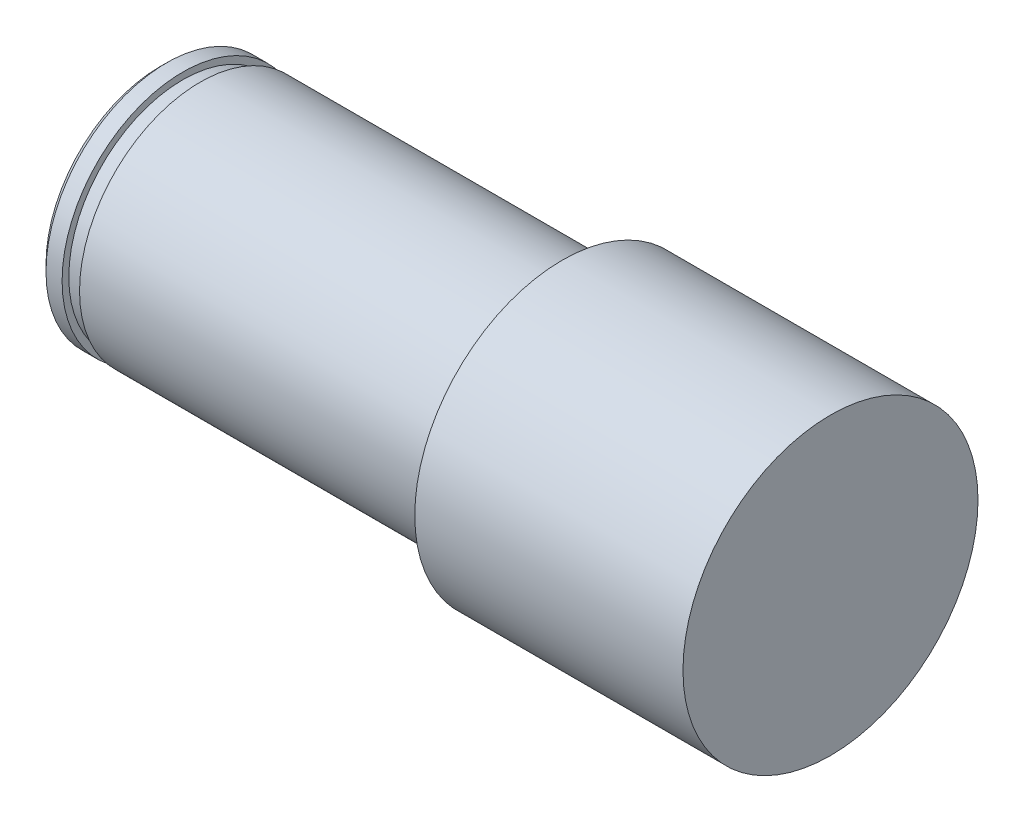
ISO-10303-21;
HEADER;
FILE_DESCRIPTION(('STEP AP214'),'2;1');
FILE_NAME('part.step','',(''),(''),'','','');
FILE_SCHEMA(('AUTOMOTIVE_DESIGN { 1 0 10303 214 1 1 1 1 }'));
ENDSEC;
DATA;
#1=APPLICATION_CONTEXT('core data for automotive mechanical design processes');
#2=APPLICATION_PROTOCOL_DEFINITION('international standard','automotive_design',2000,#1);
#3=PRODUCT_CONTEXT('',#1,'mechanical');
#4=PRODUCT('Part','Part','',(#3));
#5=PRODUCT_RELATED_PRODUCT_CATEGORY('part','',(#4));
#6=PRODUCT_DEFINITION_FORMATION('','',#4);
#7=PRODUCT_DEFINITION_CONTEXT('part definition',#1,'design');
#8=PRODUCT_DEFINITION('design','',#6,#7);
#9=PRODUCT_DEFINITION_SHAPE('','',#8);
#10=(LENGTH_UNIT() NAMED_UNIT(*) SI_UNIT(.MILLI.,.METRE.));
#11=(NAMED_UNIT(*) PLANE_ANGLE_UNIT() SI_UNIT($,.RADIAN.));
#12=(NAMED_UNIT(*) SI_UNIT($,.STERADIAN.) SOLID_ANGLE_UNIT());
#13=UNCERTAINTY_MEASURE_WITH_UNIT(LENGTH_MEASURE(1.E-05),#10,'distance_accuracy_value','');
#14=(GEOMETRIC_REPRESENTATION_CONTEXT(3) GLOBAL_UNCERTAINTY_ASSIGNED_CONTEXT((#13)) GLOBAL_UNIT_ASSIGNED_CONTEXT((#10,
#11,#12)) REPRESENTATION_CONTEXT('',''));
#15=CARTESIAN_POINT('',(0.,0.,0.));
#16=DIRECTION('',(0.,0.,1.));
#17=DIRECTION('',(1.,0.,0.));
#18=AXIS2_PLACEMENT_3D('',#15,#16,#17);
#19=CARTESIAN_POINT('',(0.,0.,0.));
#20=DIRECTION('',(-1.,0.,0.));
#21=DIRECTION('',(0.,0.,1.));
#22=AXIS2_PLACEMENT_3D('',#19,#20,#21);
#23=PLANE('',#22);
#24=CARTESIAN_POINT('',(0.,0.,0.));
#25=DIRECTION('',(-1.,0.,0.));
#26=DIRECTION('',(0.,0.,1.));
#27=AXIS2_PLACEMENT_3D('',#24,#25,#26);
#28=CIRCLE('',#27,11.);
#29=CARTESIAN_POINT('',(0.,0.,11.));
#30=VERTEX_POINT('',#29);
#31=EDGE_CURVE('E55',#30,#30,#28,.T.);
#32=ORIENTED_EDGE('',*,*,#31,.F.);
#33=EDGE_LOOP('',(#32));
#34=FACE_BOUND('',#33,.T.);
#35=ADVANCED_FACE('F43',(#34),#23,.F.);
#36=CARTESIAN_POINT('',(-50.,0.,0.));
#37=DIRECTION('',(-1.,0.,0.));
#38=DIRECTION('',(0.,0.,1.));
#39=AXIS2_PLACEMENT_3D('',#36,#37,#38);
#40=CYLINDRICAL_SURFACE('',#39,11.);
#41=CARTESIAN_POINT('',(-20.,0.,0.));
#42=DIRECTION('',(-1.,0.,0.));
#43=DIRECTION('',(0.,0.,1.));
#44=AXIS2_PLACEMENT_3D('',#41,#42,#43);
#45=CIRCLE('',#44,11.);
#46=CARTESIAN_POINT('',(-20.,0.,11.));
#47=VERTEX_POINT('',#46);
#48=EDGE_CURVE('E59',#47,#47,#45,.T.);
#49=ORIENTED_EDGE('',*,*,#48,.F.);
#50=EDGE_LOOP('',(#49));
#51=FACE_BOUND('',#50,.T.);
#52=ORIENTED_EDGE('',*,*,#31,.T.);
#53=EDGE_LOOP('',(#52));
#54=FACE_BOUND('',#53,.T.);
#55=ADVANCED_FACE('F109',(#51,#54),#40,.T.);
#56=CARTESIAN_POINT('',(-20.,0.,-11.));
#57=DIRECTION('',(1.,0.,0.));
#58=DIRECTION('',(0.,0.,-1.));
#59=AXIS2_PLACEMENT_3D('',#56,#57,#58);
#60=PLANE('',#59);
#61=CARTESIAN_POINT('',(-20.,0.,0.));
#62=DIRECTION('',(-1.,0.,0.));
#63=DIRECTION('',(0.,0.,1.));
#64=AXIS2_PLACEMENT_3D('',#61,#62,#63);
#65=CIRCLE('',#64,9.);
#66=CARTESIAN_POINT('',(-20.,0.,9.));
#67=VERTEX_POINT('',#66);
#68=EDGE_CURVE('E64',#67,#67,#65,.T.);
#69=ORIENTED_EDGE('',*,*,#68,.F.);
#70=EDGE_LOOP('',(#69));
#71=FACE_BOUND('',#70,.T.);
#72=ORIENTED_EDGE('',*,*,#48,.T.);
#73=EDGE_LOOP('',(#72));
#74=FACE_BOUND('',#73,.T.);
#75=ADVANCED_FACE('F103',(#71,#74),#60,.F.);
#76=CARTESIAN_POINT('',(-50.,0.,0.));
#77=DIRECTION('',(-1.,0.,0.));
#78=DIRECTION('',(0.,0.,1.));
#79=AXIS2_PLACEMENT_3D('',#76,#77,#78);
#80=CYLINDRICAL_SURFACE('',#79,9.);
#81=CARTESIAN_POINT('',(-47.,0.,0.));
#82=DIRECTION('',(-1.,0.,0.));
#83=DIRECTION('',(0.,0.,1.));
#84=AXIS2_PLACEMENT_3D('',#81,#82,#83);
#85=CIRCLE('',#84,8.99999999999999);
#86=CARTESIAN_POINT('',(-47.,0.,8.99999999999999));
#87=VERTEX_POINT('',#86);
#88=EDGE_CURVE('E67',#87,#87,#85,.T.);
#89=ORIENTED_EDGE('',*,*,#88,.F.);
#90=EDGE_LOOP('',(#89));
#91=FACE_BOUND('',#90,.T.);
#92=ORIENTED_EDGE('',*,*,#68,.T.);
#93=EDGE_LOOP('',(#92));
#94=FACE_BOUND('',#93,.T.);
#95=ADVANCED_FACE('F97',(#91,#94),#80,.T.);
#96=CARTESIAN_POINT('',(-47.,0.,-8.99999999999999));
#97=DIRECTION('',(1.,0.,0.));
#98=DIRECTION('',(0.,0.,-1.));
#99=AXIS2_PLACEMENT_3D('',#96,#97,#98);
#100=PLANE('',#99);
#101=CARTESIAN_POINT('',(-47.,0.,0.));
#102=DIRECTION('',(-1.,0.,0.));
#103=DIRECTION('',(0.,0.,1.));
#104=AXIS2_PLACEMENT_3D('',#101,#102,#103);
#105=CIRCLE('',#104,8.5);
#106=CARTESIAN_POINT('',(-47.,0.,8.5));
#107=VERTEX_POINT('',#106);
#108=EDGE_CURVE('E70',#107,#107,#105,.T.);
#109=ORIENTED_EDGE('',*,*,#108,.F.);
#110=EDGE_LOOP('',(#109));
#111=FACE_BOUND('',#110,.T.);
#112=ORIENTED_EDGE('',*,*,#88,.T.);
#113=EDGE_LOOP('',(#112));
#114=FACE_BOUND('',#113,.T.);
#115=ADVANCED_FACE('F91',(#111,#114),#100,.F.);
#116=CARTESIAN_POINT('',(-50.,0.,0.));
#117=DIRECTION('',(-1.,0.,0.));
#118=DIRECTION('',(0.,0.,1.));
#119=AXIS2_PLACEMENT_3D('',#116,#117,#118);
#120=CYLINDRICAL_SURFACE('',#119,8.5);
#121=CARTESIAN_POINT('',(-48.3,0.,0.));
#122=DIRECTION('',(-1.,0.,0.));
#123=DIRECTION('',(0.,0.,1.));
#124=AXIS2_PLACEMENT_3D('',#121,#122,#123);
#125=CIRCLE('',#124,8.5);
#126=CARTESIAN_POINT('',(-48.3,0.,8.5));
#127=VERTEX_POINT('',#126);
#128=EDGE_CURVE('E73',#127,#127,#125,.T.);
#129=ORIENTED_EDGE('',*,*,#128,.F.);
#130=EDGE_LOOP('',(#129));
#131=FACE_BOUND('',#130,.T.);
#132=ORIENTED_EDGE('',*,*,#108,.T.);
#133=EDGE_LOOP('',(#132));
#134=FACE_BOUND('',#133,.T.);
#135=ADVANCED_FACE('F85',(#131,#134),#120,.T.);
#136=CARTESIAN_POINT('',(-48.3,0.,-8.5));
#137=DIRECTION('',(-1.,0.,0.));
#138=DIRECTION('',(0.,0.,1.));
#139=AXIS2_PLACEMENT_3D('',#136,#137,#138);
#140=PLANE('',#139);
#141=CARTESIAN_POINT('',(-48.3,0.,0.));
#142=DIRECTION('',(-1.,0.,0.));
#143=DIRECTION('',(0.,0.,1.));
#144=AXIS2_PLACEMENT_3D('',#141,#142,#143);
#145=CIRCLE('',#144,9.);
#146=CARTESIAN_POINT('',(-48.3,0.,9.));
#147=VERTEX_POINT('',#146);
#148=EDGE_CURVE('E76',#147,#147,#145,.T.);
#149=ORIENTED_EDGE('',*,*,#148,.F.);
#150=EDGE_LOOP('',(#149));
#151=FACE_BOUND('',#150,.T.);
#152=ORIENTED_EDGE('',*,*,#128,.T.);
#153=EDGE_LOOP('',(#152));
#154=FACE_BOUND('',#153,.T.);
#155=ADVANCED_FACE('F82',(#151,#154),#140,.F.);
#156=CARTESIAN_POINT('',(-50.,0.,0.));
#157=DIRECTION('',(-1.,0.,0.));
#158=DIRECTION('',(0.,0.,1.));
#159=AXIS2_PLACEMENT_3D('',#156,#157,#158);
#160=CYLINDRICAL_SURFACE('',#159,9.);
#161=CARTESIAN_POINT('',(-49.5,0.,0.));
#162=DIRECTION('',(1.,0.,0.));
#163=DIRECTION('',(0.,0.,-1.));
#164=AXIS2_PLACEMENT_3D('',#161,#162,#163);
#165=CIRCLE('',#164,9.);
#166=CARTESIAN_POINT('',(-49.5,0.,-9.));
#167=VERTEX_POINT('',#166);
#168=EDGE_CURVE('E10',#167,#167,#165,.T.);
#169=ORIENTED_EDGE('',*,*,#168,.T.);
#170=EDGE_LOOP('',(#169));
#171=FACE_BOUND('',#170,.T.);
#172=ORIENTED_EDGE('',*,*,#148,.T.);
#173=EDGE_LOOP('',(#172));
#174=FACE_BOUND('',#173,.T.);
#175=ADVANCED_FACE('F80',(#171,#174),#160,.T.);
#176=CARTESIAN_POINT('',(-50.,0.,-9.));
#177=DIRECTION('',(1.,0.,0.));
#178=DIRECTION('',(0.,0.,-1.));
#179=AXIS2_PLACEMENT_3D('',#176,#177,#178);
#180=PLANE('',#179);
#181=CARTESIAN_POINT('',(-50.,0.,0.));
#182=DIRECTION('',(1.,0.,0.));
#183=DIRECTION('',(0.,0.,-1.));
#184=AXIS2_PLACEMENT_3D('',#181,#182,#183);
#185=CIRCLE('',#184,8.5);
#186=CARTESIAN_POINT('',(-50.,0.,-8.5));
#187=VERTEX_POINT('',#186);
#188=EDGE_CURVE('E51',#187,#187,#185,.F.);
#189=ORIENTED_EDGE('',*,*,#188,.T.);
#190=EDGE_LOOP('',(#189));
#191=FACE_BOUND('',#190,.T.);
#192=ADVANCED_FACE('F124',(#191),#180,.F.);
#193=CARTESIAN_POINT('',(-50.,0.,0.));
#194=DIRECTION('',(1.,0.,0.));
#195=DIRECTION('',(0.,0.,-1.));
#196=AXIS2_PLACEMENT_3D('',#193,#194,#195);
#197=CONICAL_SURFACE('',#196,8.5,0.785398163397448);
#198=ORIENTED_EDGE('',*,*,#168,.F.);
#199=EDGE_LOOP('',(#198));
#200=FACE_BOUND('',#199,.T.);
#201=ORIENTED_EDGE('',*,*,#188,.F.);
#202=EDGE_LOOP('',(#201));
#203=FACE_BOUND('',#202,.T.);
#204=ADVANCED_FACE('F46',(#200,#203),#197,.T.);
#205=CLOSED_SHELL('',(#35,#55,#75,#95,#115,#135,#155,#175,#192,#204));
#206=MANIFOLD_SOLID_BREP('B2',#205);
#207=ADVANCED_BREP_SHAPE_REPRESENTATION('',(#18,#206),#14);
#208=SHAPE_DEFINITION_REPRESENTATION(#9,#207);
ENDSEC;
END-ISO-10303-21;
